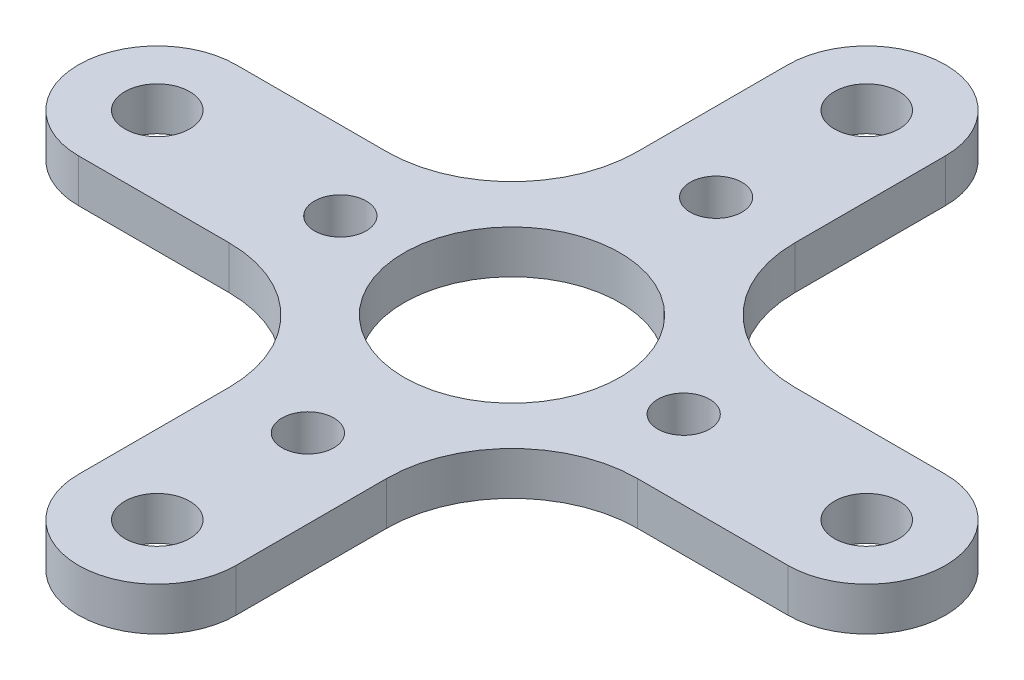
ISO-10303-21;
HEADER;
FILE_DESCRIPTION(('STEP AP214'),'2;1');
FILE_NAME('part.step','',(''),(''),'','','');
FILE_SCHEMA(('AUTOMOTIVE_DESIGN { 1 0 10303 214 1 1 1 1 }'));
ENDSEC;
DATA;
#1=APPLICATION_CONTEXT('core data for automotive mechanical design processes');
#2=APPLICATION_PROTOCOL_DEFINITION('international standard','automotive_design',2000,#1);
#3=PRODUCT_CONTEXT('',#1,'mechanical');
#4=PRODUCT('Part','Part','',(#3));
#5=PRODUCT_RELATED_PRODUCT_CATEGORY('part','',(#4));
#6=PRODUCT_DEFINITION_FORMATION('','',#4);
#7=PRODUCT_DEFINITION_CONTEXT('part definition',#1,'design');
#8=PRODUCT_DEFINITION('design','',#6,#7);
#9=PRODUCT_DEFINITION_SHAPE('','',#8);
#10=(LENGTH_UNIT() NAMED_UNIT(*) SI_UNIT(.MILLI.,.METRE.));
#11=(NAMED_UNIT(*) PLANE_ANGLE_UNIT() SI_UNIT($,.RADIAN.));
#12=(NAMED_UNIT(*) SI_UNIT($,.STERADIAN.) SOLID_ANGLE_UNIT());
#13=UNCERTAINTY_MEASURE_WITH_UNIT(LENGTH_MEASURE(1.E-05),#10,'distance_accuracy_value','');
#14=(GEOMETRIC_REPRESENTATION_CONTEXT(3) GLOBAL_UNCERTAINTY_ASSIGNED_CONTEXT((#13)) GLOBAL_UNIT_ASSIGNED_CONTEXT((#10,
#11,#12)) REPRESENTATION_CONTEXT('',''));
#15=CARTESIAN_POINT('',(0.,0.,0.));
#16=DIRECTION('',(0.,0.,1.));
#17=DIRECTION('',(1.,0.,0.));
#18=AXIS2_PLACEMENT_3D('',#15,#16,#17);
#19=CARTESIAN_POINT('',(-18.2323460896462,2.,-7.3502328992608));
#20=DIRECTION('',(0.,1.,0.));
#21=DIRECTION('',(0.,0.,1.));
#22=AXIS2_PLACEMENT_3D('',#19,#20,#21);
#23=PLANE('',#22);
#24=CARTESIAN_POINT('',(-18.2323460896462,2.,-14.3252328992607));
#25=DIRECTION('',(0.,1.,0.));
#26=DIRECTION('',(0.,0.,1.));
#27=AXIS2_PLACEMENT_3D('',#24,#25,#26);
#28=CIRCLE('',#27,1.2);
#29=CARTESIAN_POINT('',(-18.2323460896462,2.,-13.1252328992607));
#30=VERTEX_POINT('',#29);
#31=EDGE_CURVE('E359',#30,#30,#28,.T.);
#32=ORIENTED_EDGE('',*,*,#31,.F.);
#33=EDGE_LOOP('',(#32));
#34=FACE_BOUND('',#33,.T.);
#35=CARTESIAN_POINT('',(-10.2823460896462,2.,-23.7752328992608));
#36=DIRECTION('',(0.,1.,0.));
#37=DIRECTION('',(0.,0.,1.));
#38=AXIS2_PLACEMENT_3D('',#35,#36,#37);
#39=CIRCLE('',#38,1.2);
#40=CARTESIAN_POINT('',(-10.2823460896462,2.,-22.5752328992608));
#41=VERTEX_POINT('',#40);
#42=EDGE_CURVE('E371',#41,#41,#39,.T.);
#43=ORIENTED_EDGE('',*,*,#42,.F.);
#44=EDGE_LOOP('',(#43));
#45=FACE_BOUND('',#44,.T.);
#46=CARTESIAN_POINT('',(-34.6573460896462,2.,-23.7752328992609));
#47=DIRECTION('',(0.,1.,0.));
#48=DIRECTION('',(0.,0.,1.));
#49=AXIS2_PLACEMENT_3D('',#46,#47,#48);
#50=CIRCLE('',#49,1.5);
#51=CARTESIAN_POINT('',(-34.6573460896462,2.,-22.2752328992609));
#52=VERTEX_POINT('',#51);
#53=EDGE_CURVE('E383',#52,#52,#50,.T.);
#54=ORIENTED_EDGE('',*,*,#53,.F.);
#55=EDGE_LOOP('',(#54));
#56=FACE_BOUND('',#55,.T.);
#57=CARTESIAN_POINT('',(-18.2323460896462,2.,-7.3502328992608));
#58=DIRECTION('',(0.,1.,0.));
#59=DIRECTION('',(0.,0.,1.));
#60=AXIS2_PLACEMENT_3D('',#57,#58,#59);
#61=CIRCLE('',#60,1.5);
#62=CARTESIAN_POINT('',(-18.2323460896462,2.,-5.8502328992608));
#63=VERTEX_POINT('',#62);
#64=EDGE_CURVE('E395',#63,#63,#61,.T.);
#65=ORIENTED_EDGE('',*,*,#64,.F.);
#66=EDGE_LOOP('',(#65));
#67=FACE_BOUND('',#66,.T.);
#68=CARTESIAN_POINT('',(-18.2323460896462,2.,-7.3502328992608));
#69=DIRECTION('',(0.,1.,0.));
#70=DIRECTION('',(0.,0.,1.));
#71=AXIS2_PLACEMENT_3D('',#68,#69,#70);
#72=CIRCLE('',#71,3.65);
#73=CARTESIAN_POINT('',(-21.8823460896462,2.,-7.3502328992608));
#74=VERTEX_POINT('',#73);
#75=CARTESIAN_POINT('',(-14.5823460896462,2.,-7.3502328992608));
#76=VERTEX_POINT('',#75);
#77=EDGE_CURVE('E204',#74,#76,#72,.T.);
#78=ORIENTED_EDGE('',*,*,#77,.T.);
#79=DIRECTION('',(0.,0.,-1.));
#80=VECTOR('',#79,1.);
#81=CARTESIAN_POINT('',(-14.582346089646,2.,-14.3252328992607));
#82=LINE('',#81,#80);
#83=CARTESIAN_POINT('',(-14.582346089646,2.,-14.3252328992607));
#84=VERTEX_POINT('',#83);
#85=EDGE_CURVE('E112',#76,#84,#82,.T.);
#86=ORIENTED_EDGE('',*,*,#85,.T.);
#87=CARTESIAN_POINT('',(-8.78234608964604,2.,-14.3252328992607));
#88=DIRECTION('',(0.,-1.,0.));
#89=DIRECTION('',(0.,0.,1.));
#90=AXIS2_PLACEMENT_3D('',#87,#88,#89);
#91=CIRCLE('',#90,5.80000000000001);
#92=CARTESIAN_POINT('',(-8.78234608964603,2.,-20.1252328992607));
#93=VERTEX_POINT('',#92);
#94=EDGE_CURVE('E243',#84,#93,#91,.T.);
#95=ORIENTED_EDGE('',*,*,#94,.T.);
#96=DIRECTION('',(1.,0.,0.));
#97=VECTOR('',#96,1.);
#98=CARTESIAN_POINT('',(-1.8073460896462,2.,-20.1252328992607));
#99=LINE('',#98,#97);
#100=CARTESIAN_POINT('',(-1.8073460896462,2.,-20.1252328992607));
#101=VERTEX_POINT('',#100);
#102=EDGE_CURVE('E262',#93,#101,#99,.T.);
#103=ORIENTED_EDGE('',*,*,#102,.T.);
#104=CARTESIAN_POINT('',(-1.80734608964618,2.,-23.7752328992607));
#105=DIRECTION('',(0.,1.,0.));
#106=DIRECTION('',(0.,0.,-1.));
#107=AXIS2_PLACEMENT_3D('',#104,#105,#106);
#108=CIRCLE('',#107,3.65);
#109=CARTESIAN_POINT('',(-1.80734608964618,2.,-27.4252328992607));
#110=VERTEX_POINT('',#109);
#111=EDGE_CURVE('E259',#101,#110,#108,.T.);
#112=ORIENTED_EDGE('',*,*,#111,.T.);
#113=DIRECTION('',(-1.,0.,0.));
#114=VECTOR('',#113,1.);
#115=CARTESIAN_POINT('',(-1.80734608964618,2.,-27.4252328992607));
#116=LINE('',#115,#114);
#117=CARTESIAN_POINT('',(-8.78234608964619,2.,-27.4252328992607));
#118=VERTEX_POINT('',#117);
#119=EDGE_CURVE('E261',#110,#118,#116,.T.);
#120=ORIENTED_EDGE('',*,*,#119,.T.);
#121=CARTESIAN_POINT('',(-8.78234608964617,2.,-33.2252328992608));
#122=DIRECTION('',(0.,-1.,0.));
#123=DIRECTION('',(0.,0.,1.));
#124=AXIS2_PLACEMENT_3D('',#121,#122,#123);
#125=CIRCLE('',#124,5.80000000000001);
#126=CARTESIAN_POINT('',(-14.5823460896462,2.,-33.2252328992607));
#127=VERTEX_POINT('',#126);
#128=EDGE_CURVE('E264',#118,#127,#125,.T.);
#129=ORIENTED_EDGE('',*,*,#128,.T.);
#130=DIRECTION('',(0.,0.,-1.));
#131=VECTOR('',#130,1.);
#132=CARTESIAN_POINT('',(-14.5823460896462,2.,-40.2002328992608));
#133=LINE('',#132,#131);
#134=CARTESIAN_POINT('',(-14.5823460896462,2.,-40.2002328992608));
#135=VERTEX_POINT('',#134);
#136=EDGE_CURVE('E270',#127,#135,#133,.T.);
#137=ORIENTED_EDGE('',*,*,#136,.T.);
#138=CARTESIAN_POINT('',(-18.2323460896462,2.,-40.2002328992608));
#139=DIRECTION('',(0.,1.,0.));
#140=DIRECTION('',(0.,0.,-1.));
#141=AXIS2_PLACEMENT_3D('',#138,#139,#140);
#142=CIRCLE('',#141,3.65);
#143=CARTESIAN_POINT('',(-21.8823460896462,2.,-40.2002328992608));
#144=VERTEX_POINT('',#143);
#145=EDGE_CURVE('E272',#135,#144,#142,.T.);
#146=ORIENTED_EDGE('',*,*,#145,.T.);
#147=DIRECTION('',(0.,0.,1.));
#148=VECTOR('',#147,1.);
#149=CARTESIAN_POINT('',(-21.8823460896462,2.,-40.2002328992608));
#150=LINE('',#149,#148);
#151=CARTESIAN_POINT('',(-21.8823460896461,2.,-33.2252328992606));
#152=VERTEX_POINT('',#151);
#153=EDGE_CURVE('E274',#144,#152,#150,.T.);
#154=ORIENTED_EDGE('',*,*,#153,.T.);
#155=CARTESIAN_POINT('',(-27.6823460896461,2.,-33.2252328992607));
#156=DIRECTION('',(0.,-1.,0.));
#157=DIRECTION('',(0.,0.,1.));
#158=AXIS2_PLACEMENT_3D('',#155,#156,#157);
#159=CIRCLE('',#158,5.80000000000002);
#160=CARTESIAN_POINT('',(-27.6823460896461,2.,-27.4252328992607));
#161=VERTEX_POINT('',#160);
#162=EDGE_CURVE('E276',#152,#161,#159,.T.);
#163=ORIENTED_EDGE('',*,*,#162,.T.);
#164=DIRECTION('',(-1.,0.,0.));
#165=VECTOR('',#164,1.);
#166=CARTESIAN_POINT('',(-27.6823460896461,2.,-27.4252328992607));
#167=LINE('',#166,#165);
#168=CARTESIAN_POINT('',(-34.6573460896462,2.,-27.4252328992607));
#169=VERTEX_POINT('',#168);
#170=EDGE_CURVE('E278',#161,#169,#167,.T.);
#171=ORIENTED_EDGE('',*,*,#170,.T.);
#172=CARTESIAN_POINT('',(-34.6573460896462,2.,-23.7752328992609));
#173=DIRECTION('',(0.,1.,0.));
#174=DIRECTION('',(0.,0.,1.));
#175=AXIS2_PLACEMENT_3D('',#172,#173,#174);
#176=CIRCLE('',#175,3.65);
#177=CARTESIAN_POINT('',(-34.6573460896462,2.,-20.1252328992609));
#178=VERTEX_POINT('',#177);
#179=EDGE_CURVE('E155',#169,#178,#176,.T.);
#180=ORIENTED_EDGE('',*,*,#179,.T.);
#181=DIRECTION('',(1.,0.,0.));
#182=VECTOR('',#181,1.);
#183=CARTESIAN_POINT('',(-27.682346089646,2.,-20.1252328992606));
#184=LINE('',#183,#182);
#185=CARTESIAN_POINT('',(-27.682346089646,2.,-20.1252328992606));
#186=VERTEX_POINT('',#185);
#187=EDGE_CURVE('E149',#178,#186,#184,.T.);
#188=ORIENTED_EDGE('',*,*,#187,.T.);
#189=CARTESIAN_POINT('',(-27.6823460896461,2.,-14.3252328992606));
#190=DIRECTION('',(0.,-1.,0.));
#191=DIRECTION('',(0.,0.,1.));
#192=AXIS2_PLACEMENT_3D('',#189,#190,#191);
#193=CIRCLE('',#192,5.80000000000001);
#194=CARTESIAN_POINT('',(-21.8823460896461,2.,-14.3252328992606));
#195=VERTEX_POINT('',#194);
#196=EDGE_CURVE('E153',#186,#195,#193,.T.);
#197=ORIENTED_EDGE('',*,*,#196,.T.);
#198=DIRECTION('',(0.,0.,1.));
#199=VECTOR('',#198,1.);
#200=CARTESIAN_POINT('',(-21.8823460896461,2.,-14.3252328992606));
#201=LINE('',#200,#199);
#202=EDGE_CURVE('E45',#195,#74,#201,.T.);
#203=ORIENTED_EDGE('',*,*,#202,.T.);
#204=EDGE_LOOP('',(#78,#86,#95,#103,#112,#120,#129,#137,#146,#154,#163,#171,#180,#188,#197,#203));
#205=FACE_BOUND('',#204,.T.);
#206=CARTESIAN_POINT('',(-18.2323460896462,2.,-40.2002328992608));
#207=DIRECTION('',(0.,1.,0.));
#208=DIRECTION('',(0.,0.,1.));
#209=AXIS2_PLACEMENT_3D('',#206,#207,#208);
#210=CIRCLE('',#209,1.5);
#211=CARTESIAN_POINT('',(-18.2323460896462,2.,-38.7002328992608));
#212=VERTEX_POINT('',#211);
#213=EDGE_CURVE('E177',#212,#212,#210,.T.);
#214=ORIENTED_EDGE('',*,*,#213,.F.);
#215=EDGE_LOOP('',(#214));
#216=FACE_BOUND('',#215,.T.);
#217=CARTESIAN_POINT('',(-1.80734608964618,2.,-23.7752328992607));
#218=DIRECTION('',(0.,1.,0.));
#219=DIRECTION('',(0.,0.,1.));
#220=AXIS2_PLACEMENT_3D('',#217,#218,#219);
#221=CIRCLE('',#220,1.50000000000001);
#222=CARTESIAN_POINT('',(-1.80734608964618,2.,-22.2752328992607));
#223=VERTEX_POINT('',#222);
#224=EDGE_CURVE('E389',#223,#223,#221,.T.);
#225=ORIENTED_EDGE('',*,*,#224,.F.);
#226=EDGE_LOOP('',(#225));
#227=FACE_BOUND('',#226,.T.);
#228=CARTESIAN_POINT('',(-26.1823460896462,2.,-23.7752328992608));
#229=DIRECTION('',(0.,1.,0.));
#230=DIRECTION('',(0.,0.,1.));
#231=AXIS2_PLACEMENT_3D('',#228,#229,#230);
#232=CIRCLE('',#231,1.2);
#233=CARTESIAN_POINT('',(-26.1823460896462,2.,-22.5752328992608));
#234=VERTEX_POINT('',#233);
#235=EDGE_CURVE('E377',#234,#234,#232,.T.);
#236=ORIENTED_EDGE('',*,*,#235,.F.);
#237=EDGE_LOOP('',(#236));
#238=FACE_BOUND('',#237,.T.);
#239=CARTESIAN_POINT('',(-18.2323460896462,2.,-33.2252328992607));
#240=DIRECTION('',(0.,1.,0.));
#241=DIRECTION('',(0.,0.,1.));
#242=AXIS2_PLACEMENT_3D('',#239,#240,#241);
#243=CIRCLE('',#242,1.2);
#244=CARTESIAN_POINT('',(-18.2323460896462,2.,-32.0252328992607));
#245=VERTEX_POINT('',#244);
#246=EDGE_CURVE('E365',#245,#245,#243,.T.);
#247=ORIENTED_EDGE('',*,*,#246,.F.);
#248=EDGE_LOOP('',(#247));
#249=FACE_BOUND('',#248,.T.);
#250=CARTESIAN_POINT('',(-18.2323460896462,2.,-23.7752328992607));
#251=DIRECTION('',(0.,1.,0.));
#252=DIRECTION('',(0.,0.,1.));
#253=AXIS2_PLACEMENT_3D('',#250,#251,#252);
#254=CIRCLE('',#253,5.);
#255=CARTESIAN_POINT('',(-18.2323460896462,2.,-18.7752328992607));
#256=VERTEX_POINT('',#255);
#257=EDGE_CURVE('E350',#256,#256,#254,.T.);
#258=ORIENTED_EDGE('',*,*,#257,.F.);
#259=EDGE_LOOP('',(#258));
#260=FACE_BOUND('',#259,.T.);
#261=ADVANCED_FACE('F28',(#34,#45,#56,#67,#205,#216,#227,#238,#249,#260),#23,.T.);
#262=CARTESIAN_POINT('',(-18.2323460896462,0.,-7.3502328992608));
#263=DIRECTION('',(0.,1.,0.));
#264=DIRECTION('',(0.,0.,1.));
#265=AXIS2_PLACEMENT_3D('',#262,#263,#264);
#266=PLANE('',#265);
#267=CARTESIAN_POINT('',(-18.2323460896462,0.,-14.3252328992607));
#268=DIRECTION('',(0.,1.,0.));
#269=DIRECTION('',(0.,0.,1.));
#270=AXIS2_PLACEMENT_3D('',#267,#268,#269);
#271=CIRCLE('',#270,1.2);
#272=CARTESIAN_POINT('',(-18.2323460896462,0.,-13.1252328992607));
#273=VERTEX_POINT('',#272);
#274=EDGE_CURVE('E356',#273,#273,#271,.T.);
#275=ORIENTED_EDGE('',*,*,#274,.T.);
#276=EDGE_LOOP('',(#275));
#277=FACE_BOUND('',#276,.T.);
#278=CARTESIAN_POINT('',(-10.2823460896462,0.,-23.7752328992608));
#279=DIRECTION('',(0.,1.,0.));
#280=DIRECTION('',(0.,0.,1.));
#281=AXIS2_PLACEMENT_3D('',#278,#279,#280);
#282=CIRCLE('',#281,1.2);
#283=CARTESIAN_POINT('',(-10.2823460896462,0.,-22.5752328992608));
#284=VERTEX_POINT('',#283);
#285=EDGE_CURVE('E368',#284,#284,#282,.T.);
#286=ORIENTED_EDGE('',*,*,#285,.T.);
#287=EDGE_LOOP('',(#286));
#288=FACE_BOUND('',#287,.T.);
#289=CARTESIAN_POINT('',(-34.6573460896462,0.,-23.7752328992609));
#290=DIRECTION('',(0.,1.,0.));
#291=DIRECTION('',(0.,0.,1.));
#292=AXIS2_PLACEMENT_3D('',#289,#290,#291);
#293=CIRCLE('',#292,1.5);
#294=CARTESIAN_POINT('',(-34.6573460896462,0.,-22.2752328992609));
#295=VERTEX_POINT('',#294);
#296=EDGE_CURVE('E380',#295,#295,#293,.T.);
#297=ORIENTED_EDGE('',*,*,#296,.T.);
#298=EDGE_LOOP('',(#297));
#299=FACE_BOUND('',#298,.T.);
#300=CARTESIAN_POINT('',(-18.2323460896462,0.,-7.3502328992608));
#301=DIRECTION('',(0.,1.,0.));
#302=DIRECTION('',(0.,0.,1.));
#303=AXIS2_PLACEMENT_3D('',#300,#301,#302);
#304=CIRCLE('',#303,1.5);
#305=CARTESIAN_POINT('',(-18.2323460896462,0.,-5.8502328992608));
#306=VERTEX_POINT('',#305);
#307=EDGE_CURVE('E392',#306,#306,#304,.T.);
#308=ORIENTED_EDGE('',*,*,#307,.T.);
#309=EDGE_LOOP('',(#308));
#310=FACE_BOUND('',#309,.T.);
#311=CARTESIAN_POINT('',(-18.2323460896462,0.,-7.3502328992608));
#312=DIRECTION('',(0.,1.,0.));
#313=DIRECTION('',(0.,0.,1.));
#314=AXIS2_PLACEMENT_3D('',#311,#312,#313);
#315=CIRCLE('',#314,3.65);
#316=CARTESIAN_POINT('',(-21.8823460896462,0.,-7.3502328992608));
#317=VERTEX_POINT('',#316);
#318=CARTESIAN_POINT('',(-14.5823460896462,0.,-7.3502328992608));
#319=VERTEX_POINT('',#318);
#320=EDGE_CURVE('E173',#317,#319,#315,.T.);
#321=ORIENTED_EDGE('',*,*,#320,.F.);
#322=DIRECTION('',(0.,0.,1.));
#323=VECTOR('',#322,1.);
#324=CARTESIAN_POINT('',(-21.8823460896461,0.,-14.3252328992606));
#325=LINE('',#324,#323);
#326=CARTESIAN_POINT('',(-21.8823460896461,0.,-14.3252328992606));
#327=VERTEX_POINT('',#326);
#328=EDGE_CURVE('E104',#327,#317,#325,.T.);
#329=ORIENTED_EDGE('',*,*,#328,.F.);
#330=CARTESIAN_POINT('',(-27.6823460896461,0.,-14.3252328992606));
#331=DIRECTION('',(0.,-1.,0.));
#332=DIRECTION('',(0.,0.,1.));
#333=AXIS2_PLACEMENT_3D('',#330,#331,#332);
#334=CIRCLE('',#333,5.80000000000001);
#335=CARTESIAN_POINT('',(-27.682346089646,0.,-20.1252328992606));
#336=VERTEX_POINT('',#335);
#337=EDGE_CURVE('E98',#336,#327,#334,.T.);
#338=ORIENTED_EDGE('',*,*,#337,.F.);
#339=DIRECTION('',(1.,0.,0.));
#340=VECTOR('',#339,1.);
#341=CARTESIAN_POINT('',(-27.682346089646,0.,-20.1252328992606));
#342=LINE('',#341,#340);
#343=CARTESIAN_POINT('',(-34.6573460896462,0.,-20.1252328992609));
#344=VERTEX_POINT('',#343);
#345=EDGE_CURVE('E163',#344,#336,#342,.T.);
#346=ORIENTED_EDGE('',*,*,#345,.F.);
#347=CARTESIAN_POINT('',(-34.6573460896462,0.,-23.7752328992609));
#348=DIRECTION('',(0.,1.,0.));
#349=DIRECTION('',(0.,0.,1.));
#350=AXIS2_PLACEMENT_3D('',#347,#348,#349);
#351=CIRCLE('',#350,3.65);
#352=CARTESIAN_POINT('',(-34.6573460896462,0.,-27.4252328992607));
#353=VERTEX_POINT('',#352);
#354=EDGE_CURVE('E199',#353,#344,#351,.T.);
#355=ORIENTED_EDGE('',*,*,#354,.F.);
#356=DIRECTION('',(-1.,0.,0.));
#357=VECTOR('',#356,1.);
#358=CARTESIAN_POINT('',(-27.6823460896461,0.,-27.4252328992607));
#359=LINE('',#358,#357);
#360=CARTESIAN_POINT('',(-27.6823460896461,0.,-27.4252328992607));
#361=VERTEX_POINT('',#360);
#362=EDGE_CURVE('E197',#361,#353,#359,.T.);
#363=ORIENTED_EDGE('',*,*,#362,.F.);
#364=CARTESIAN_POINT('',(-27.6823460896461,0.,-33.2252328992607));
#365=DIRECTION('',(0.,-1.,0.));
#366=DIRECTION('',(0.,0.,1.));
#367=AXIS2_PLACEMENT_3D('',#364,#365,#366);
#368=CIRCLE('',#367,5.80000000000002);
#369=CARTESIAN_POINT('',(-21.8823460896461,0.,-33.2252328992606));
#370=VERTEX_POINT('',#369);
#371=EDGE_CURVE('E195',#370,#361,#368,.T.);
#372=ORIENTED_EDGE('',*,*,#371,.F.);
#373=DIRECTION('',(0.,0.,1.));
#374=VECTOR('',#373,1.);
#375=CARTESIAN_POINT('',(-21.8823460896462,0.,-40.2002328992608));
#376=LINE('',#375,#374);
#377=CARTESIAN_POINT('',(-21.8823460896462,0.,-40.2002328992608));
#378=VERTEX_POINT('',#377);
#379=EDGE_CURVE('E193',#378,#370,#376,.T.);
#380=ORIENTED_EDGE('',*,*,#379,.F.);
#381=CARTESIAN_POINT('',(-18.2323460896462,0.,-40.2002328992608));
#382=DIRECTION('',(0.,1.,0.));
#383=DIRECTION('',(0.,0.,-1.));
#384=AXIS2_PLACEMENT_3D('',#381,#382,#383);
#385=CIRCLE('',#384,3.65);
#386=CARTESIAN_POINT('',(-14.5823460896462,0.,-40.2002328992608));
#387=VERTEX_POINT('',#386);
#388=EDGE_CURVE('E191',#387,#378,#385,.T.);
#389=ORIENTED_EDGE('',*,*,#388,.F.);
#390=DIRECTION('',(0.,0.,-1.));
#391=VECTOR('',#390,1.);
#392=CARTESIAN_POINT('',(-14.5823460896462,0.,-40.2002328992608));
#393=LINE('',#392,#391);
#394=CARTESIAN_POINT('',(-14.5823460896462,0.,-33.2252328992607));
#395=VERTEX_POINT('',#394);
#396=EDGE_CURVE('E189',#395,#387,#393,.T.);
#397=ORIENTED_EDGE('',*,*,#396,.F.);
#398=CARTESIAN_POINT('',(-8.78234608964617,0.,-33.2252328992608));
#399=DIRECTION('',(0.,-1.,0.));
#400=DIRECTION('',(0.,0.,1.));
#401=AXIS2_PLACEMENT_3D('',#398,#399,#400);
#402=CIRCLE('',#401,5.80000000000001);
#403=CARTESIAN_POINT('',(-8.78234608964619,0.,-27.4252328992607));
#404=VERTEX_POINT('',#403);
#405=EDGE_CURVE('E187',#404,#395,#402,.T.);
#406=ORIENTED_EDGE('',*,*,#405,.F.);
#407=DIRECTION('',(-1.,0.,0.));
#408=VECTOR('',#407,1.);
#409=CARTESIAN_POINT('',(-1.80734608964618,0.,-27.4252328992607));
#410=LINE('',#409,#408);
#411=CARTESIAN_POINT('',(-1.80734608964618,0.,-27.4252328992607));
#412=VERTEX_POINT('',#411);
#413=EDGE_CURVE('E185',#412,#404,#410,.T.);
#414=ORIENTED_EDGE('',*,*,#413,.F.);
#415=CARTESIAN_POINT('',(-1.80734608964618,0.,-23.7752328992607));
#416=DIRECTION('',(0.,1.,0.));
#417=DIRECTION('',(0.,0.,-1.));
#418=AXIS2_PLACEMENT_3D('',#415,#416,#417);
#419=CIRCLE('',#418,3.65);
#420=CARTESIAN_POINT('',(-1.8073460896462,0.,-20.1252328992607));
#421=VERTEX_POINT('',#420);
#422=EDGE_CURVE('E183',#421,#412,#419,.T.);
#423=ORIENTED_EDGE('',*,*,#422,.F.);
#424=DIRECTION('',(1.,0.,0.));
#425=VECTOR('',#424,1.);
#426=CARTESIAN_POINT('',(-1.8073460896462,0.,-20.1252328992607));
#427=LINE('',#426,#425);
#428=CARTESIAN_POINT('',(-8.78234608964603,0.,-20.1252328992607));
#429=VERTEX_POINT('',#428);
#430=EDGE_CURVE('E181',#429,#421,#427,.T.);
#431=ORIENTED_EDGE('',*,*,#430,.F.);
#432=CARTESIAN_POINT('',(-8.78234608964604,0.,-14.3252328992607));
#433=DIRECTION('',(0.,-1.,0.));
#434=DIRECTION('',(0.,0.,1.));
#435=AXIS2_PLACEMENT_3D('',#432,#433,#434);
#436=CIRCLE('',#435,5.80000000000001);
#437=CARTESIAN_POINT('',(-14.582346089646,0.,-14.3252328992607));
#438=VERTEX_POINT('',#437);
#439=EDGE_CURVE('E179',#438,#429,#436,.T.);
#440=ORIENTED_EDGE('',*,*,#439,.F.);
#441=DIRECTION('',(0.,0.,-1.));
#442=VECTOR('',#441,1.);
#443=CARTESIAN_POINT('',(-14.582346089646,0.,-14.3252328992607));
#444=LINE('',#443,#442);
#445=EDGE_CURVE('E176',#319,#438,#444,.T.);
#446=ORIENTED_EDGE('',*,*,#445,.F.);
#447=EDGE_LOOP('',(#321,#329,#338,#346,#355,#363,#372,#380,#389,#397,#406,#414,#423,#431,#440,#446));
#448=FACE_BOUND('',#447,.T.);
#449=CARTESIAN_POINT('',(-18.2323460896462,0.,-40.2002328992608));
#450=DIRECTION('',(0.,1.,0.));
#451=DIRECTION('',(0.,0.,1.));
#452=AXIS2_PLACEMENT_3D('',#449,#450,#451);
#453=CIRCLE('',#452,1.5);
#454=CARTESIAN_POINT('',(-18.2323460896462,0.,-38.7002328992608));
#455=VERTEX_POINT('',#454);
#456=EDGE_CURVE('E398',#455,#455,#453,.T.);
#457=ORIENTED_EDGE('',*,*,#456,.T.);
#458=EDGE_LOOP('',(#457));
#459=FACE_BOUND('',#458,.T.);
#460=CARTESIAN_POINT('',(-1.80734608964618,0.,-23.7752328992607));
#461=DIRECTION('',(0.,1.,0.));
#462=DIRECTION('',(0.,0.,1.));
#463=AXIS2_PLACEMENT_3D('',#460,#461,#462);
#464=CIRCLE('',#463,1.50000000000001);
#465=CARTESIAN_POINT('',(-1.80734608964618,0.,-22.2752328992607));
#466=VERTEX_POINT('',#465);
#467=EDGE_CURVE('E386',#466,#466,#464,.T.);
#468=ORIENTED_EDGE('',*,*,#467,.T.);
#469=EDGE_LOOP('',(#468));
#470=FACE_BOUND('',#469,.T.);
#471=CARTESIAN_POINT('',(-26.1823460896462,0.,-23.7752328992608));
#472=DIRECTION('',(0.,1.,0.));
#473=DIRECTION('',(0.,0.,1.));
#474=AXIS2_PLACEMENT_3D('',#471,#472,#473);
#475=CIRCLE('',#474,1.2);
#476=CARTESIAN_POINT('',(-26.1823460896462,0.,-22.5752328992608));
#477=VERTEX_POINT('',#476);
#478=EDGE_CURVE('E374',#477,#477,#475,.T.);
#479=ORIENTED_EDGE('',*,*,#478,.T.);
#480=EDGE_LOOP('',(#479));
#481=FACE_BOUND('',#480,.T.);
#482=CARTESIAN_POINT('',(-18.2323460896462,0.,-33.2252328992607));
#483=DIRECTION('',(0.,1.,0.));
#484=DIRECTION('',(0.,0.,1.));
#485=AXIS2_PLACEMENT_3D('',#482,#483,#484);
#486=CIRCLE('',#485,1.2);
#487=CARTESIAN_POINT('',(-18.2323460896462,0.,-32.0252328992607));
#488=VERTEX_POINT('',#487);
#489=EDGE_CURVE('E362',#488,#488,#486,.T.);
#490=ORIENTED_EDGE('',*,*,#489,.T.);
#491=EDGE_LOOP('',(#490));
#492=FACE_BOUND('',#491,.T.);
#493=CARTESIAN_POINT('',(-18.2323460896462,0.,-23.7752328992607));
#494=DIRECTION('',(0.,1.,0.));
#495=DIRECTION('',(0.,0.,1.));
#496=AXIS2_PLACEMENT_3D('',#493,#494,#495);
#497=CIRCLE('',#496,5.);
#498=CARTESIAN_POINT('',(-18.2323460896462,0.,-18.7752328992607));
#499=VERTEX_POINT('',#498);
#500=EDGE_CURVE('E353',#499,#499,#497,.T.);
#501=ORIENTED_EDGE('',*,*,#500,.T.);
#502=EDGE_LOOP('',(#501));
#503=FACE_BOUND('',#502,.T.);
#504=ADVANCED_FACE('F247',(#277,#288,#299,#310,#448,#459,#470,#481,#492,#503),#266,.F.);
#505=CARTESIAN_POINT('',(-18.2323460896462,2.,-7.3502328992608));
#506=DIRECTION('',(0.,-1.,0.));
#507=DIRECTION('',(0.,0.,-1.));
#508=AXIS2_PLACEMENT_3D('',#505,#506,#507);
#509=CYLINDRICAL_SURFACE('',#508,3.65);
#510=ORIENTED_EDGE('',*,*,#320,.T.);
#511=DIRECTION('',(0.,-1.,0.));
#512=VECTOR('',#511,1.);
#513=CARTESIAN_POINT('',(-14.5823460896462,2.,-7.3502328992608));
#514=LINE('',#513,#512);
#515=EDGE_CURVE('E11',#76,#319,#514,.T.);
#516=ORIENTED_EDGE('',*,*,#515,.F.);
#517=ORIENTED_EDGE('',*,*,#77,.F.);
#518=DIRECTION('',(0.,-1.,0.));
#519=VECTOR('',#518,1.);
#520=CARTESIAN_POINT('',(-21.8823460896462,2.,-7.3502328992608));
#521=LINE('',#520,#519);
#522=EDGE_CURVE('E169',#74,#317,#521,.T.);
#523=ORIENTED_EDGE('',*,*,#522,.T.);
#524=EDGE_LOOP('',(#510,#516,#517,#523));
#525=FACE_BOUND('',#524,.T.);
#526=ADVANCED_FACE('F30',(#525),#509,.T.);
#527=CARTESIAN_POINT('',(-14.582346089646,2.,-14.3252328992607));
#528=DIRECTION('',(-1.,0.,0.));
#529=DIRECTION('',(0.,0.,1.));
#530=AXIS2_PLACEMENT_3D('',#527,#528,#529);
#531=PLANE('',#530);
#532=ORIENTED_EDGE('',*,*,#445,.T.);
#533=DIRECTION('',(0.,-1.,0.));
#534=VECTOR('',#533,1.);
#535=CARTESIAN_POINT('',(-14.582346089646,2.,-14.3252328992607));
#536=LINE('',#535,#534);
#537=EDGE_CURVE('E37',#84,#438,#536,.T.);
#538=ORIENTED_EDGE('',*,*,#537,.F.);
#539=ORIENTED_EDGE('',*,*,#85,.F.);
#540=ORIENTED_EDGE('',*,*,#515,.T.);
#541=EDGE_LOOP('',(#532,#538,#539,#540));
#542=FACE_BOUND('',#541,.T.);
#543=ADVANCED_FACE('F592',(#542),#531,.F.);
#544=CARTESIAN_POINT('',(-8.78234608964604,2.,-14.3252328992607));
#545=DIRECTION('',(0.,-1.,0.));
#546=DIRECTION('',(0.,0.,-1.));
#547=AXIS2_PLACEMENT_3D('',#544,#545,#546);
#548=CYLINDRICAL_SURFACE('',#547,5.80000000000001);
#549=ORIENTED_EDGE('',*,*,#439,.T.);
#550=DIRECTION('',(0.,-1.,0.));
#551=VECTOR('',#550,1.);
#552=CARTESIAN_POINT('',(-8.78234608964603,2.,-20.1252328992607));
#553=LINE('',#552,#551);
#554=EDGE_CURVE('E235',#93,#429,#553,.T.);
#555=ORIENTED_EDGE('',*,*,#554,.F.);
#556=ORIENTED_EDGE('',*,*,#94,.F.);
#557=ORIENTED_EDGE('',*,*,#537,.T.);
#558=EDGE_LOOP('',(#549,#555,#556,#557));
#559=FACE_BOUND('',#558,.T.);
#560=ADVANCED_FACE('F241',(#559),#548,.F.);
#561=CARTESIAN_POINT('',(-1.8073460896462,2.,-20.1252328992607));
#562=DIRECTION('',(0.,0.,-1.));
#563=DIRECTION('',(-1.,0.,0.));
#564=AXIS2_PLACEMENT_3D('',#561,#562,#563);
#565=PLANE('',#564);
#566=ORIENTED_EDGE('',*,*,#430,.T.);
#567=DIRECTION('',(0.,-1.,0.));
#568=VECTOR('',#567,1.);
#569=CARTESIAN_POINT('',(-1.8073460896462,2.,-20.1252328992607));
#570=LINE('',#569,#568);
#571=EDGE_CURVE('E232',#101,#421,#570,.T.);
#572=ORIENTED_EDGE('',*,*,#571,.F.);
#573=ORIENTED_EDGE('',*,*,#102,.F.);
#574=ORIENTED_EDGE('',*,*,#554,.T.);
#575=EDGE_LOOP('',(#566,#572,#573,#574));
#576=FACE_BOUND('',#575,.T.);
#577=ADVANCED_FACE('F253',(#576),#565,.F.);
#578=CARTESIAN_POINT('',(-1.80734608964618,2.,-23.7752328992607));
#579=DIRECTION('',(0.,-1.,0.));
#580=DIRECTION('',(0.,0.,-1.));
#581=AXIS2_PLACEMENT_3D('',#578,#579,#580);
#582=CYLINDRICAL_SURFACE('',#581,3.65);
#583=ORIENTED_EDGE('',*,*,#422,.T.);
#584=DIRECTION('',(0.,-1.,0.));
#585=VECTOR('',#584,1.);
#586=CARTESIAN_POINT('',(-1.80734608964618,2.,-27.4252328992607));
#587=LINE('',#586,#585);
#588=EDGE_CURVE('E229',#110,#412,#587,.T.);
#589=ORIENTED_EDGE('',*,*,#588,.F.);
#590=ORIENTED_EDGE('',*,*,#111,.F.);
#591=ORIENTED_EDGE('',*,*,#571,.T.);
#592=EDGE_LOOP('',(#583,#589,#590,#591));
#593=FACE_BOUND('',#592,.T.);
#594=ADVANCED_FACE('F257',(#593),#582,.T.);
#595=CARTESIAN_POINT('',(-1.80734608964618,2.,-27.4252328992607));
#596=DIRECTION('',(0.,0.,1.));
#597=DIRECTION('',(1.,0.,0.));
#598=AXIS2_PLACEMENT_3D('',#595,#596,#597);
#599=PLANE('',#598);
#600=ORIENTED_EDGE('',*,*,#413,.T.);
#601=DIRECTION('',(0.,-1.,0.));
#602=VECTOR('',#601,1.);
#603=CARTESIAN_POINT('',(-8.78234608964619,2.,-27.4252328992607));
#604=LINE('',#603,#602);
#605=EDGE_CURVE('E226',#118,#404,#604,.T.);
#606=ORIENTED_EDGE('',*,*,#605,.F.);
#607=ORIENTED_EDGE('',*,*,#119,.F.);
#608=ORIENTED_EDGE('',*,*,#588,.T.);
#609=EDGE_LOOP('',(#600,#606,#607,#608));
#610=FACE_BOUND('',#609,.T.);
#611=ADVANCED_FACE('F557',(#610),#599,.F.);
#612=CARTESIAN_POINT('',(-8.78234608964617,2.,-33.2252328992608));
#613=DIRECTION('',(0.,-1.,0.));
#614=DIRECTION('',(0.,0.,-1.));
#615=AXIS2_PLACEMENT_3D('',#612,#613,#614);
#616=CYLINDRICAL_SURFACE('',#615,5.80000000000001);
#617=ORIENTED_EDGE('',*,*,#405,.T.);
#618=DIRECTION('',(0.,-1.,0.));
#619=VECTOR('',#618,1.);
#620=CARTESIAN_POINT('',(-14.5823460896462,2.,-33.2252328992607));
#621=LINE('',#620,#619);
#622=EDGE_CURVE('E223',#127,#395,#621,.T.);
#623=ORIENTED_EDGE('',*,*,#622,.F.);
#624=ORIENTED_EDGE('',*,*,#128,.F.);
#625=ORIENTED_EDGE('',*,*,#605,.T.);
#626=EDGE_LOOP('',(#617,#623,#624,#625));
#627=FACE_BOUND('',#626,.T.);
#628=ADVANCED_FACE('F547',(#627),#616,.F.);
#629=CARTESIAN_POINT('',(-14.5823460896462,2.,-40.2002328992608));
#630=DIRECTION('',(-1.,0.,0.));
#631=DIRECTION('',(0.,0.,1.));
#632=AXIS2_PLACEMENT_3D('',#629,#630,#631);
#633=PLANE('',#632);
#634=ORIENTED_EDGE('',*,*,#396,.T.);
#635=DIRECTION('',(0.,-1.,0.));
#636=VECTOR('',#635,1.);
#637=CARTESIAN_POINT('',(-14.5823460896462,2.,-40.2002328992608));
#638=LINE('',#637,#636);
#639=EDGE_CURVE('E220',#135,#387,#638,.T.);
#640=ORIENTED_EDGE('',*,*,#639,.F.);
#641=ORIENTED_EDGE('',*,*,#136,.F.);
#642=ORIENTED_EDGE('',*,*,#622,.T.);
#643=EDGE_LOOP('',(#634,#640,#641,#642));
#644=FACE_BOUND('',#643,.T.);
#645=ADVANCED_FACE('F537',(#644),#633,.F.);
#646=CARTESIAN_POINT('',(-18.2323460896462,2.,-40.2002328992608));
#647=DIRECTION('',(0.,-1.,0.));
#648=DIRECTION('',(0.,0.,-1.));
#649=AXIS2_PLACEMENT_3D('',#646,#647,#648);
#650=CYLINDRICAL_SURFACE('',#649,3.65);
#651=ORIENTED_EDGE('',*,*,#388,.T.);
#652=DIRECTION('',(0.,-1.,0.));
#653=VECTOR('',#652,1.);
#654=CARTESIAN_POINT('',(-21.8823460896462,2.,-40.2002328992608));
#655=LINE('',#654,#653);
#656=EDGE_CURVE('E217',#144,#378,#655,.T.);
#657=ORIENTED_EDGE('',*,*,#656,.F.);
#658=ORIENTED_EDGE('',*,*,#145,.F.);
#659=ORIENTED_EDGE('',*,*,#639,.T.);
#660=EDGE_LOOP('',(#651,#657,#658,#659));
#661=FACE_BOUND('',#660,.T.);
#662=ADVANCED_FACE('F527',(#661),#650,.T.);
#663=CARTESIAN_POINT('',(-21.8823460896462,2.,-40.2002328992608));
#664=DIRECTION('',(1.,0.,0.));
#665=DIRECTION('',(0.,0.,-1.));
#666=AXIS2_PLACEMENT_3D('',#663,#664,#665);
#667=PLANE('',#666);
#668=ORIENTED_EDGE('',*,*,#379,.T.);
#669=DIRECTION('',(0.,-1.,0.));
#670=VECTOR('',#669,1.);
#671=CARTESIAN_POINT('',(-21.8823460896461,2.,-33.2252328992606));
#672=LINE('',#671,#670);
#673=EDGE_CURVE('E214',#152,#370,#672,.T.);
#674=ORIENTED_EDGE('',*,*,#673,.F.);
#675=ORIENTED_EDGE('',*,*,#153,.F.);
#676=ORIENTED_EDGE('',*,*,#656,.T.);
#677=EDGE_LOOP('',(#668,#674,#675,#676));
#678=FACE_BOUND('',#677,.T.);
#679=ADVANCED_FACE('F517',(#678),#667,.F.);
#680=CARTESIAN_POINT('',(-27.6823460896461,2.,-33.2252328992607));
#681=DIRECTION('',(0.,-1.,0.));
#682=DIRECTION('',(0.,0.,-1.));
#683=AXIS2_PLACEMENT_3D('',#680,#681,#682);
#684=CYLINDRICAL_SURFACE('',#683,5.80000000000002);
#685=ORIENTED_EDGE('',*,*,#371,.T.);
#686=DIRECTION('',(0.,-1.,0.));
#687=VECTOR('',#686,1.);
#688=CARTESIAN_POINT('',(-27.6823460896461,2.,-27.4252328992607));
#689=LINE('',#688,#687);
#690=EDGE_CURVE('E211',#161,#361,#689,.T.);
#691=ORIENTED_EDGE('',*,*,#690,.F.);
#692=ORIENTED_EDGE('',*,*,#162,.F.);
#693=ORIENTED_EDGE('',*,*,#673,.T.);
#694=EDGE_LOOP('',(#685,#691,#692,#693));
#695=FACE_BOUND('',#694,.T.);
#696=ADVANCED_FACE('F508',(#695),#684,.F.);
#697=CARTESIAN_POINT('',(-27.6823460896461,2.,-27.4252328992607));
#698=DIRECTION('',(0.,0.,1.));
#699=DIRECTION('',(1.,0.,0.));
#700=AXIS2_PLACEMENT_3D('',#697,#698,#699);
#701=PLANE('',#700);
#702=ORIENTED_EDGE('',*,*,#362,.T.);
#703=DIRECTION('',(0.,-1.,0.));
#704=VECTOR('',#703,1.);
#705=CARTESIAN_POINT('',(-34.6573460896462,2.,-27.4252328992607));
#706=LINE('',#705,#704);
#707=EDGE_CURVE('E208',#169,#353,#706,.T.);
#708=ORIENTED_EDGE('',*,*,#707,.F.);
#709=ORIENTED_EDGE('',*,*,#170,.F.);
#710=ORIENTED_EDGE('',*,*,#690,.T.);
#711=EDGE_LOOP('',(#702,#708,#709,#710));
#712=FACE_BOUND('',#711,.T.);
#713=ADVANCED_FACE('F284',(#712),#701,.F.);
#714=CARTESIAN_POINT('',(-34.6573460896462,2.,-23.7752328992609));
#715=DIRECTION('',(0.,-1.,0.));
#716=DIRECTION('',(0.,0.,-1.));
#717=AXIS2_PLACEMENT_3D('',#714,#715,#716);
#718=CYLINDRICAL_SURFACE('',#717,3.65);
#719=ORIENTED_EDGE('',*,*,#354,.T.);
#720=DIRECTION('',(0.,-1.,0.));
#721=VECTOR('',#720,1.);
#722=CARTESIAN_POINT('',(-34.6573460896462,2.,-20.1252328992609));
#723=LINE('',#722,#721);
#724=EDGE_CURVE('E164',#178,#344,#723,.T.);
#725=ORIENTED_EDGE('',*,*,#724,.F.);
#726=ORIENTED_EDGE('',*,*,#179,.F.);
#727=ORIENTED_EDGE('',*,*,#707,.T.);
#728=EDGE_LOOP('',(#719,#725,#726,#727));
#729=FACE_BOUND('',#728,.T.);
#730=ADVANCED_FACE('F288',(#729),#718,.T.);
#731=CARTESIAN_POINT('',(-27.682346089646,2.,-20.1252328992606));
#732=DIRECTION('',(0.,0.,-1.));
#733=DIRECTION('',(-1.,0.,0.));
#734=AXIS2_PLACEMENT_3D('',#731,#732,#733);
#735=PLANE('',#734);
#736=ORIENTED_EDGE('',*,*,#345,.T.);
#737=DIRECTION('',(0.,-1.,0.));
#738=VECTOR('',#737,1.);
#739=CARTESIAN_POINT('',(-27.682346089646,2.,-20.1252328992606));
#740=LINE('',#739,#738);
#741=EDGE_CURVE('E160',#186,#336,#740,.T.);
#742=ORIENTED_EDGE('',*,*,#741,.F.);
#743=ORIENTED_EDGE('',*,*,#187,.F.);
#744=ORIENTED_EDGE('',*,*,#724,.T.);
#745=EDGE_LOOP('',(#736,#742,#743,#744));
#746=FACE_BOUND('',#745,.T.);
#747=ADVANCED_FACE('F161',(#746),#735,.F.);
#748=CARTESIAN_POINT('',(-27.6823460896461,2.,-14.3252328992606));
#749=DIRECTION('',(0.,-1.,0.));
#750=DIRECTION('',(0.,0.,-1.));
#751=AXIS2_PLACEMENT_3D('',#748,#749,#750);
#752=CYLINDRICAL_SURFACE('',#751,5.80000000000001);
#753=ORIENTED_EDGE('',*,*,#337,.T.);
#754=DIRECTION('',(0.,-1.,0.));
#755=VECTOR('',#754,1.);
#756=CARTESIAN_POINT('',(-21.8823460896461,2.,-14.3252328992606));
#757=LINE('',#756,#755);
#758=EDGE_CURVE('E165',#195,#327,#757,.T.);
#759=ORIENTED_EDGE('',*,*,#758,.F.);
#760=ORIENTED_EDGE('',*,*,#196,.F.);
#761=ORIENTED_EDGE('',*,*,#741,.T.);
#762=EDGE_LOOP('',(#753,#759,#760,#761));
#763=FACE_BOUND('',#762,.T.);
#764=ADVANCED_FACE('F167',(#763),#752,.F.);
#765=CARTESIAN_POINT('',(-21.8823460896461,2.,-14.3252328992606));
#766=DIRECTION('',(1.,0.,0.));
#767=DIRECTION('',(0.,0.,-1.));
#768=AXIS2_PLACEMENT_3D('',#765,#766,#767);
#769=PLANE('',#768);
#770=ORIENTED_EDGE('',*,*,#328,.T.);
#771=ORIENTED_EDGE('',*,*,#522,.F.);
#772=ORIENTED_EDGE('',*,*,#202,.F.);
#773=ORIENTED_EDGE('',*,*,#758,.T.);
#774=EDGE_LOOP('',(#770,#771,#772,#773));
#775=FACE_BOUND('',#774,.T.);
#776=ADVANCED_FACE('F292',(#775),#769,.F.);
#777=CARTESIAN_POINT('',(-18.2323460896462,2.,-40.2002328992608));
#778=DIRECTION('',(0.,-1.,0.));
#779=DIRECTION('',(0.,0.,-1.));
#780=AXIS2_PLACEMENT_3D('',#777,#778,#779);
#781=CYLINDRICAL_SURFACE('',#780,1.5);
#782=ORIENTED_EDGE('',*,*,#213,.T.);
#783=EDGE_LOOP('',(#782));
#784=FACE_BOUND('',#783,.T.);
#785=ORIENTED_EDGE('',*,*,#456,.F.);
#786=EDGE_LOOP('',(#785));
#787=FACE_BOUND('',#786,.T.);
#788=ADVANCED_FACE('F294',(#784,#787),#781,.F.);
#789=CARTESIAN_POINT('',(-18.2323460896462,2.,-7.3502328992608));
#790=DIRECTION('',(0.,-1.,0.));
#791=DIRECTION('',(0.,0.,-1.));
#792=AXIS2_PLACEMENT_3D('',#789,#790,#791);
#793=CYLINDRICAL_SURFACE('',#792,1.5);
#794=ORIENTED_EDGE('',*,*,#64,.T.);
#795=EDGE_LOOP('',(#794));
#796=FACE_BOUND('',#795,.T.);
#797=ORIENTED_EDGE('',*,*,#307,.F.);
#798=EDGE_LOOP('',(#797));
#799=FACE_BOUND('',#798,.T.);
#800=ADVANCED_FACE('F300',(#796,#799),#793,.F.);
#801=CARTESIAN_POINT('',(-1.80734608964618,2.,-23.7752328992607));
#802=DIRECTION('',(0.,-1.,0.));
#803=DIRECTION('',(0.,0.,-1.));
#804=AXIS2_PLACEMENT_3D('',#801,#802,#803);
#805=CYLINDRICAL_SURFACE('',#804,1.50000000000001);
#806=ORIENTED_EDGE('',*,*,#224,.T.);
#807=EDGE_LOOP('',(#806));
#808=FACE_BOUND('',#807,.T.);
#809=ORIENTED_EDGE('',*,*,#467,.F.);
#810=EDGE_LOOP('',(#809));
#811=FACE_BOUND('',#810,.T.);
#812=ADVANCED_FACE('F317',(#808,#811),#805,.F.);
#813=CARTESIAN_POINT('',(-34.6573460896462,2.,-23.7752328992609));
#814=DIRECTION('',(0.,-1.,0.));
#815=DIRECTION('',(0.,0.,-1.));
#816=AXIS2_PLACEMENT_3D('',#813,#814,#815);
#817=CYLINDRICAL_SURFACE('',#816,1.5);
#818=ORIENTED_EDGE('',*,*,#53,.T.);
#819=EDGE_LOOP('',(#818));
#820=FACE_BOUND('',#819,.T.);
#821=ORIENTED_EDGE('',*,*,#296,.F.);
#822=EDGE_LOOP('',(#821));
#823=FACE_BOUND('',#822,.T.);
#824=ADVANCED_FACE('F321',(#820,#823),#817,.F.);
#825=CARTESIAN_POINT('',(-26.1823460896462,2.,-23.7752328992608));
#826=DIRECTION('',(0.,-1.,0.));
#827=DIRECTION('',(0.,0.,-1.));
#828=AXIS2_PLACEMENT_3D('',#825,#826,#827);
#829=CYLINDRICAL_SURFACE('',#828,1.2);
#830=ORIENTED_EDGE('',*,*,#235,.T.);
#831=EDGE_LOOP('',(#830));
#832=FACE_BOUND('',#831,.T.);
#833=ORIENTED_EDGE('',*,*,#478,.F.);
#834=EDGE_LOOP('',(#833));
#835=FACE_BOUND('',#834,.T.);
#836=ADVANCED_FACE('F325',(#832,#835),#829,.F.);
#837=CARTESIAN_POINT('',(-10.2823460896462,2.,-23.7752328992608));
#838=DIRECTION('',(0.,-1.,0.));
#839=DIRECTION('',(0.,0.,-1.));
#840=AXIS2_PLACEMENT_3D('',#837,#838,#839);
#841=CYLINDRICAL_SURFACE('',#840,1.2);
#842=ORIENTED_EDGE('',*,*,#42,.T.);
#843=EDGE_LOOP('',(#842));
#844=FACE_BOUND('',#843,.T.);
#845=ORIENTED_EDGE('',*,*,#285,.F.);
#846=EDGE_LOOP('',(#845));
#847=FACE_BOUND('',#846,.T.);
#848=ADVANCED_FACE('F329',(#844,#847),#841,.F.);
#849=CARTESIAN_POINT('',(-18.2323460896462,2.,-33.2252328992607));
#850=DIRECTION('',(0.,-1.,0.));
#851=DIRECTION('',(0.,0.,-1.));
#852=AXIS2_PLACEMENT_3D('',#849,#850,#851);
#853=CYLINDRICAL_SURFACE('',#852,1.2);
#854=ORIENTED_EDGE('',*,*,#246,.T.);
#855=EDGE_LOOP('',(#854));
#856=FACE_BOUND('',#855,.T.);
#857=ORIENTED_EDGE('',*,*,#489,.F.);
#858=EDGE_LOOP('',(#857));
#859=FACE_BOUND('',#858,.T.);
#860=ADVANCED_FACE('F333',(#856,#859),#853,.F.);
#861=CARTESIAN_POINT('',(-18.2323460896462,2.,-14.3252328992607));
#862=DIRECTION('',(0.,-1.,0.));
#863=DIRECTION('',(0.,0.,-1.));
#864=AXIS2_PLACEMENT_3D('',#861,#862,#863);
#865=CYLINDRICAL_SURFACE('',#864,1.2);
#866=ORIENTED_EDGE('',*,*,#31,.T.);
#867=EDGE_LOOP('',(#866));
#868=FACE_BOUND('',#867,.T.);
#869=ORIENTED_EDGE('',*,*,#274,.F.);
#870=EDGE_LOOP('',(#869));
#871=FACE_BOUND('',#870,.T.);
#872=ADVANCED_FACE('F337',(#868,#871),#865,.F.);
#873=CARTESIAN_POINT('',(-18.2323460896462,2.,-23.7752328992607));
#874=DIRECTION('',(0.,-1.,0.));
#875=DIRECTION('',(0.,0.,-1.));
#876=AXIS2_PLACEMENT_3D('',#873,#874,#875);
#877=CYLINDRICAL_SURFACE('',#876,5.);
#878=ORIENTED_EDGE('',*,*,#257,.T.);
#879=EDGE_LOOP('',(#878));
#880=FACE_BOUND('',#879,.T.);
#881=ORIENTED_EDGE('',*,*,#500,.F.);
#882=EDGE_LOOP('',(#881));
#883=FACE_BOUND('',#882,.T.);
#884=ADVANCED_FACE('F341',(#880,#883),#877,.F.);
#885=CLOSED_SHELL('',(#261,#504,#526,#543,#560,#577,#594,#611,#628,#645,#662,#679,#696,#713,
#730,#747,#764,#776,#788,#800,#812,#824,#836,#848,#860,#872,#884));
#886=MANIFOLD_SOLID_BREP('B2',#885);
#887=ADVANCED_BREP_SHAPE_REPRESENTATION('',(#18,#886),#14);
#888=SHAPE_DEFINITION_REPRESENTATION(#9,#887);
ENDSEC;
END-ISO-10303-21;
